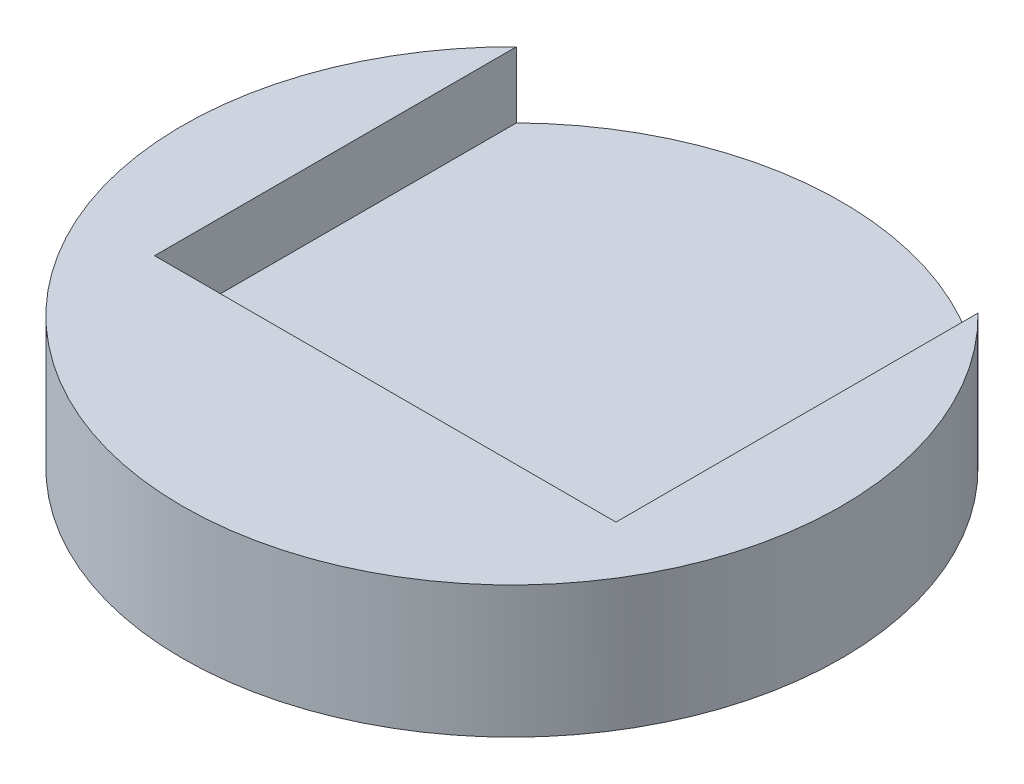
ISO-10303-21;
HEADER;
FILE_DESCRIPTION(('STEP AP214'),'2;1');
FILE_NAME('part.step','',(''),(''),'','','');
FILE_SCHEMA(('AUTOMOTIVE_DESIGN { 1 0 10303 214 1 1 1 1 }'));
ENDSEC;
DATA;
#1=APPLICATION_CONTEXT('core data for automotive mechanical design processes');
#2=APPLICATION_PROTOCOL_DEFINITION('international standard','automotive_design',2000,#1);
#3=PRODUCT_CONTEXT('',#1,'mechanical');
#4=PRODUCT('Part','Part','',(#3));
#5=PRODUCT_RELATED_PRODUCT_CATEGORY('part','',(#4));
#6=PRODUCT_DEFINITION_FORMATION('','',#4);
#7=PRODUCT_DEFINITION_CONTEXT('part definition',#1,'design');
#8=PRODUCT_DEFINITION('design','',#6,#7);
#9=PRODUCT_DEFINITION_SHAPE('','',#8);
#10=(LENGTH_UNIT() NAMED_UNIT(*) SI_UNIT(.MILLI.,.METRE.));
#11=(NAMED_UNIT(*) PLANE_ANGLE_UNIT() SI_UNIT($,.RADIAN.));
#12=(NAMED_UNIT(*) SI_UNIT($,.STERADIAN.) SOLID_ANGLE_UNIT());
#13=UNCERTAINTY_MEASURE_WITH_UNIT(LENGTH_MEASURE(1.E-05),#10,'distance_accuracy_value','');
#14=(GEOMETRIC_REPRESENTATION_CONTEXT(3) GLOBAL_UNCERTAINTY_ASSIGNED_CONTEXT((#13)) GLOBAL_UNIT_ASSIGNED_CONTEXT((#10,
#11,#12)) REPRESENTATION_CONTEXT('',''));
#15=CARTESIAN_POINT('',(0.,0.,0.));
#16=DIRECTION('',(0.,0.,1.));
#17=DIRECTION('',(1.,0.,0.));
#18=AXIS2_PLACEMENT_3D('',#15,#16,#17);
#19=CARTESIAN_POINT('',(0.,20.,0.));
#20=DIRECTION('',(0.,-1.,0.));
#21=DIRECTION('',(0.,0.,-1.));
#22=AXIS2_PLACEMENT_3D('',#19,#20,#21);
#23=CYLINDRICAL_SURFACE('',#22,50.);
#24=CARTESIAN_POINT('',(0.,0.,0.));
#25=DIRECTION('',(0.,1.,0.));
#26=DIRECTION('',(0.,0.,1.));
#27=AXIS2_PLACEMENT_3D('',#24,#25,#26);
#28=CIRCLE('',#27,50.);
#29=CARTESIAN_POINT('',(0.,0.,50.));
#30=VERTEX_POINT('',#29);
#31=EDGE_CURVE('E96',#30,#30,#28,.T.);
#32=ORIENTED_EDGE('',*,*,#31,.T.);
#33=EDGE_LOOP('',(#32));
#34=FACE_BOUND('',#33,.T.);
#35=CARTESIAN_POINT('',(0.,10.,0.));
#36=DIRECTION('',(0.,-1.,0.));
#37=DIRECTION('',(0.,0.,-1.));
#38=AXIS2_PLACEMENT_3D('',#35,#36,#37);
#39=CIRCLE('',#38,50.);
#40=CARTESIAN_POINT('',(-35.0151456159349,10.,-35.6922901688148));
#41=VERTEX_POINT('',#40);
#42=CARTESIAN_POINT('',(34.9848543840651,10.,-35.7219815201475));
#43=VERTEX_POINT('',#42);
#44=EDGE_CURVE('E11',#41,#43,#39,.T.);
#45=ORIENTED_EDGE('',*,*,#44,.T.);
#46=DIRECTION('',(0.,-1.,0.));
#47=VECTOR('',#46,1.);
#48=CARTESIAN_POINT('',(34.9848543840651,20.,-35.7219815201475));
#49=LINE('',#48,#47);
#50=CARTESIAN_POINT('',(34.9848543840651,20.,-35.7219815201475));
#51=VERTEX_POINT('',#50);
#52=EDGE_CURVE('E87',#51,#43,#49,.T.);
#53=ORIENTED_EDGE('',*,*,#52,.F.);
#54=CARTESIAN_POINT('',(0.,20.,0.));
#55=DIRECTION('',(0.,1.,0.));
#56=DIRECTION('',(0.,0.,1.));
#57=AXIS2_PLACEMENT_3D('',#54,#55,#56);
#58=CIRCLE('',#57,50.);
#59=CARTESIAN_POINT('',(-35.0151456159349,20.,-35.6922901688148));
#60=VERTEX_POINT('',#59);
#61=EDGE_CURVE('E97',#60,#51,#58,.T.);
#62=ORIENTED_EDGE('',*,*,#61,.F.);
#63=DIRECTION('',(0.,-1.,0.));
#64=VECTOR('',#63,1.);
#65=CARTESIAN_POINT('',(-35.0151456159349,20.,-35.6922901688148));
#66=LINE('',#65,#64);
#67=EDGE_CURVE('E90',#41,#60,#66,.F.);
#68=ORIENTED_EDGE('',*,*,#67,.F.);
#69=EDGE_LOOP('',(#45,#53,#62,#68));
#70=FACE_BOUND('',#69,.T.);
#71=ADVANCED_FACE('F33',(#34,#70),#23,.T.);
#72=CARTESIAN_POINT('',(0.,20.,0.));
#73=DIRECTION('',(0.,1.,0.));
#74=DIRECTION('',(0.,0.,1.));
#75=AXIS2_PLACEMENT_3D('',#72,#73,#74);
#76=PLANE('',#75);
#77=DIRECTION('',(-1.,0.,0.));
#78=VECTOR('',#77,1.);
#79=CARTESIAN_POINT('',(34.9848543840651,20.,19.2021898319126));
#80=LINE('',#79,#78);
#81=CARTESIAN_POINT('',(34.9848543840651,20.,19.2021898319126));
#82=VERTEX_POINT('',#81);
#83=CARTESIAN_POINT('',(-35.0151456159349,20.,19.2021898319127));
#84=VERTEX_POINT('',#83);
#85=EDGE_CURVE('E47',#82,#84,#80,.T.);
#86=ORIENTED_EDGE('',*,*,#85,.T.);
#87=DIRECTION('',(0.,0.,-1.));
#88=VECTOR('',#87,1.);
#89=CARTESIAN_POINT('',(-35.0151456159349,20.,19.2021898319127));
#90=LINE('',#89,#88);
#91=EDGE_CURVE('E83',#84,#60,#90,.T.);
#92=ORIENTED_EDGE('',*,*,#91,.T.);
#93=ORIENTED_EDGE('',*,*,#61,.T.);
#94=DIRECTION('',(0.,0.,1.));
#95=VECTOR('',#94,1.);
#96=CARTESIAN_POINT('',(34.9848543840651,20.,0.));
#97=LINE('',#96,#95);
#98=EDGE_CURVE('E40',#51,#82,#97,.T.);
#99=ORIENTED_EDGE('',*,*,#98,.T.);
#100=EDGE_LOOP('',(#86,#92,#93,#99));
#101=FACE_BOUND('',#100,.T.);
#102=ADVANCED_FACE('F103',(#101),#76,.T.);
#103=CARTESIAN_POINT('',(0.,0.,0.));
#104=DIRECTION('',(0.,1.,0.));
#105=DIRECTION('',(0.,0.,1.));
#106=AXIS2_PLACEMENT_3D('',#103,#104,#105);
#107=PLANE('',#106);
#108=ORIENTED_EDGE('',*,*,#31,.F.);
#109=EDGE_LOOP('',(#108));
#110=FACE_BOUND('',#109,.T.);
#111=ADVANCED_FACE('F116',(#110),#107,.F.);
#112=CARTESIAN_POINT('',(0.,10.,0.));
#113=DIRECTION('',(0.,-1.,0.));
#114=DIRECTION('',(0.,0.,-1.));
#115=AXIS2_PLACEMENT_3D('',#112,#113,#114);
#116=PLANE('',#115);
#117=DIRECTION('',(0.,0.,1.));
#118=VECTOR('',#117,1.);
#119=CARTESIAN_POINT('',(34.9848543840651,10.,-35.7978101680874));
#120=LINE('',#119,#118);
#121=CARTESIAN_POINT('',(34.9848543840651,10.,19.2021898319126));
#122=VERTEX_POINT('',#121);
#123=EDGE_CURVE('E78',#43,#122,#120,.T.);
#124=ORIENTED_EDGE('',*,*,#123,.F.);
#125=ORIENTED_EDGE('',*,*,#44,.F.);
#126=DIRECTION('',(0.,0.,-1.));
#127=VECTOR('',#126,1.);
#128=CARTESIAN_POINT('',(-35.0151456159349,10.,19.2021898319127));
#129=LINE('',#128,#127);
#130=CARTESIAN_POINT('',(-35.0151456159349,10.,19.2021898319127));
#131=VERTEX_POINT('',#130);
#132=EDGE_CURVE('E71',#131,#41,#129,.T.);
#133=ORIENTED_EDGE('',*,*,#132,.F.);
#134=DIRECTION('',(-1.,0.,0.));
#135=VECTOR('',#134,1.);
#136=CARTESIAN_POINT('',(34.9848543840651,10.,19.2021898319126));
#137=LINE('',#136,#135);
#138=EDGE_CURVE('E74',#122,#131,#137,.T.);
#139=ORIENTED_EDGE('',*,*,#138,.F.);
#140=EDGE_LOOP('',(#124,#125,#133,#139));
#141=FACE_BOUND('',#140,.T.);
#142=ADVANCED_FACE('F73',(#141),#116,.F.);
#143=CARTESIAN_POINT('',(-35.0151456159349,10.,19.2021898319127));
#144=DIRECTION('',(1.,0.,0.));
#145=DIRECTION('',(0.,0.,-1.));
#146=AXIS2_PLACEMENT_3D('',#143,#144,#145);
#147=PLANE('',#146);
#148=ORIENTED_EDGE('',*,*,#67,.T.);
#149=ORIENTED_EDGE('',*,*,#91,.F.);
#150=DIRECTION('',(0.,1.,0.));
#151=VECTOR('',#150,1.);
#152=CARTESIAN_POINT('',(-35.0151456159349,10.,19.2021898319127));
#153=LINE('',#152,#151);
#154=EDGE_CURVE('E81',#131,#84,#153,.T.);
#155=ORIENTED_EDGE('',*,*,#154,.F.);
#156=ORIENTED_EDGE('',*,*,#132,.T.);
#157=EDGE_LOOP('',(#148,#149,#155,#156));
#158=FACE_BOUND('',#157,.T.);
#159=ADVANCED_FACE('F85',(#158),#147,.T.);
#160=CARTESIAN_POINT('',(34.9848543840651,10.,-35.7978101680874));
#161=DIRECTION('',(-1.,0.,0.));
#162=DIRECTION('',(0.,0.,1.));
#163=AXIS2_PLACEMENT_3D('',#160,#161,#162);
#164=PLANE('',#163);
#165=ORIENTED_EDGE('',*,*,#52,.T.);
#166=ORIENTED_EDGE('',*,*,#123,.T.);
#167=DIRECTION('',(0.,1.,0.));
#168=VECTOR('',#167,1.);
#169=CARTESIAN_POINT('',(34.9848543840651,10.,19.2021898319126));
#170=LINE('',#169,#168);
#171=EDGE_CURVE('E82',#122,#82,#170,.T.);
#172=ORIENTED_EDGE('',*,*,#171,.T.);
#173=ORIENTED_EDGE('',*,*,#98,.F.);
#174=EDGE_LOOP('',(#165,#166,#172,#173));
#175=FACE_BOUND('',#174,.T.);
#176=ADVANCED_FACE('F107',(#175),#164,.T.);
#177=CARTESIAN_POINT('',(34.9848543840651,10.,19.2021898319126));
#178=DIRECTION('',(0.,0.,-1.));
#179=DIRECTION('',(-1.,0.,0.));
#180=AXIS2_PLACEMENT_3D('',#177,#178,#179);
#181=PLANE('',#180);
#182=ORIENTED_EDGE('',*,*,#85,.F.);
#183=ORIENTED_EDGE('',*,*,#171,.F.);
#184=ORIENTED_EDGE('',*,*,#138,.T.);
#185=ORIENTED_EDGE('',*,*,#154,.T.);
#186=EDGE_LOOP('',(#182,#183,#184,#185));
#187=FACE_BOUND('',#186,.T.);
#188=ADVANCED_FACE('F80',(#187),#181,.T.);
#189=CLOSED_SHELL('',(#71,#102,#111,#142,#159,#176,#188));
#190=MANIFOLD_SOLID_BREP('B2',#189);
#191=ADVANCED_BREP_SHAPE_REPRESENTATION('',(#18,#190),#14);
#192=SHAPE_DEFINITION_REPRESENTATION(#9,#191);
ENDSEC;
END-ISO-10303-21;
